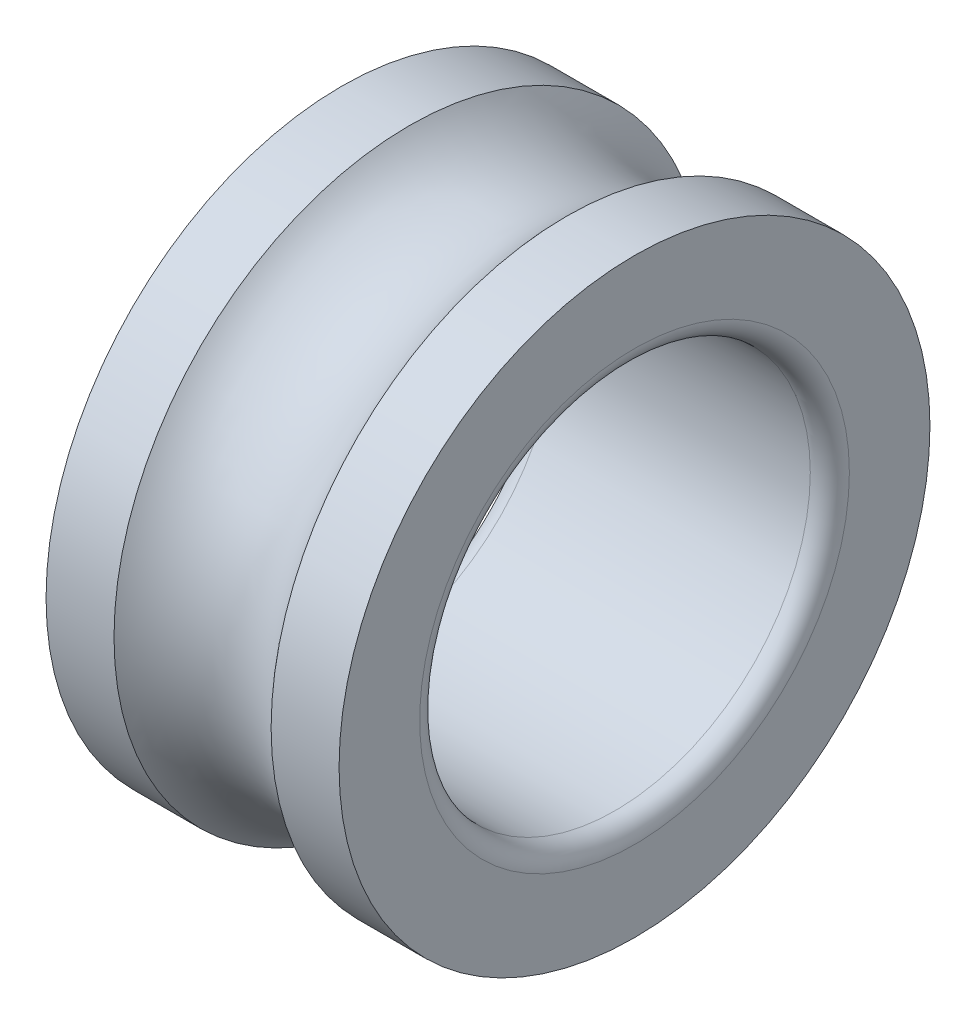
ISO-10303-21;
HEADER;
FILE_DESCRIPTION(('STEP AP214'),'2;1');
FILE_NAME('part.step','',(''),(''),'','','');
FILE_SCHEMA(('AUTOMOTIVE_DESIGN { 1 0 10303 214 1 1 1 1 }'));
ENDSEC;
DATA;
#1=APPLICATION_CONTEXT('core data for automotive mechanical design processes');
#2=APPLICATION_PROTOCOL_DEFINITION('international standard','automotive_design',2000,#1);
#3=PRODUCT_CONTEXT('',#1,'mechanical');
#4=PRODUCT('Part','Part','',(#3));
#5=PRODUCT_RELATED_PRODUCT_CATEGORY('part','',(#4));
#6=PRODUCT_DEFINITION_FORMATION('','',#4);
#7=PRODUCT_DEFINITION_CONTEXT('part definition',#1,'design');
#8=PRODUCT_DEFINITION('design','',#6,#7);
#9=PRODUCT_DEFINITION_SHAPE('','',#8);
#10=(LENGTH_UNIT() NAMED_UNIT(*) SI_UNIT(.MILLI.,.METRE.));
#11=(NAMED_UNIT(*) PLANE_ANGLE_UNIT() SI_UNIT($,.RADIAN.));
#12=(NAMED_UNIT(*) SI_UNIT($,.STERADIAN.) SOLID_ANGLE_UNIT());
#13=UNCERTAINTY_MEASURE_WITH_UNIT(LENGTH_MEASURE(1.E-05),#10,'distance_accuracy_value','');
#14=(GEOMETRIC_REPRESENTATION_CONTEXT(3) GLOBAL_UNCERTAINTY_ASSIGNED_CONTEXT((#13)) GLOBAL_UNIT_ASSIGNED_CONTEXT((#10,
#11,#12)) REPRESENTATION_CONTEXT('',''));
#15=CARTESIAN_POINT('',(0.,0.,0.));
#16=DIRECTION('',(0.,0.,1.));
#17=DIRECTION('',(1.,0.,0.));
#18=AXIS2_PLACEMENT_3D('',#15,#16,#17);
#19=CARTESIAN_POINT('',(7.5,0.,0.));
#20=DIRECTION('',(-1.,0.,0.));
#21=DIRECTION('',(0.,0.,1.));
#22=AXIS2_PLACEMENT_3D('',#19,#20,#21);
#23=CYLINDRICAL_SURFACE('',#22,15.125);
#24=CARTESIAN_POINT('',(-7.5,0.,0.));
#25=DIRECTION('',(1.,0.,0.));
#26=DIRECTION('',(0.,0.,-1.));
#27=AXIS2_PLACEMENT_3D('',#24,#25,#26);
#28=CIRCLE('',#27,15.125);
#29=CARTESIAN_POINT('',(-7.5,0.,-15.125));
#30=VERTEX_POINT('',#29);
#31=EDGE_CURVE('E70',#30,#30,#28,.T.);
#32=ORIENTED_EDGE('',*,*,#31,.T.);
#33=EDGE_LOOP('',(#32));
#34=FACE_BOUND('',#33,.T.);
#35=CARTESIAN_POINT('',(-4.02142698553635,0.,0.));
#36=DIRECTION('',(1.,0.,0.));
#37=DIRECTION('',(0.,0.,-1.));
#38=AXIS2_PLACEMENT_3D('',#35,#36,#37);
#39=CIRCLE('',#38,15.125);
#40=CARTESIAN_POINT('',(-4.02142698553635,0.,-15.125));
#41=VERTEX_POINT('',#40);
#42=EDGE_CURVE('E66',#41,#41,#39,.T.);
#43=ORIENTED_EDGE('',*,*,#42,.F.);
#44=EDGE_LOOP('',(#43));
#45=FACE_BOUND('',#44,.T.);
#46=ADVANCED_FACE('F41',(#34,#45),#23,.T.);
#47=CARTESIAN_POINT('',(7.5,0.,0.));
#48=DIRECTION('',(1.,0.,0.));
#49=DIRECTION('',(0.,0.,-1.));
#50=AXIS2_PLACEMENT_3D('',#47,#48,#49);
#51=CIRCLE('',#50,15.125);
#52=CARTESIAN_POINT('',(7.5,0.,-15.125));
#53=VERTEX_POINT('',#52);
#54=EDGE_CURVE('E65',#53,#53,#51,.T.);
#55=ORIENTED_EDGE('',*,*,#54,.F.);
#56=EDGE_LOOP('',(#55));
#57=FACE_BOUND('',#56,.T.);
#58=CARTESIAN_POINT('',(4.02142698553635,0.,0.));
#59=DIRECTION('',(-1.,0.,0.));
#60=DIRECTION('',(0.,0.,1.));
#61=AXIS2_PLACEMENT_3D('',#58,#59,#60);
#62=CIRCLE('',#61,15.125);
#63=CARTESIAN_POINT('',(4.02142698553635,0.,15.125));
#64=VERTEX_POINT('',#63);
#65=EDGE_CURVE('E71',#64,#64,#62,.T.);
#66=ORIENTED_EDGE('',*,*,#65,.F.);
#67=EDGE_LOOP('',(#66));
#68=FACE_BOUND('',#67,.T.);
#69=ADVANCED_FACE('F84',(#57,#68),#23,.T.);
#70=CARTESIAN_POINT('',(7.5,0.,0.));
#71=DIRECTION('',(1.,0.,0.));
#72=DIRECTION('',(0.,0.,-1.));
#73=AXIS2_PLACEMENT_3D('',#70,#71,#72);
#74=PLANE('',#73);
#75=CARTESIAN_POINT('',(7.5,0.,0.));
#76=DIRECTION('',(1.,0.,0.));
#77=DIRECTION('',(0.,0.,-1.));
#78=AXIS2_PLACEMENT_3D('',#75,#76,#77);
#79=CIRCLE('',#78,11.);
#80=CARTESIAN_POINT('',(7.5,0.,-11.));
#81=VERTEX_POINT('',#80);
#82=EDGE_CURVE('E10',#81,#81,#79,.F.);
#83=ORIENTED_EDGE('',*,*,#82,.T.);
#84=EDGE_LOOP('',(#83));
#85=FACE_BOUND('',#84,.T.);
#86=ORIENTED_EDGE('',*,*,#54,.T.);
#87=EDGE_LOOP('',(#86));
#88=FACE_BOUND('',#87,.T.);
#89=ADVANCED_FACE('F82',(#85,#88),#74,.T.);
#90=CARTESIAN_POINT('',(-7.5,0.,0.));
#91=DIRECTION('',(1.,0.,0.));
#92=DIRECTION('',(0.,0.,-1.));
#93=AXIS2_PLACEMENT_3D('',#90,#91,#92);
#94=PLANE('',#93);
#95=CARTESIAN_POINT('',(-7.5,0.,0.));
#96=DIRECTION('',(1.,0.,0.));
#97=DIRECTION('',(0.,0.,-1.));
#98=AXIS2_PLACEMENT_3D('',#95,#96,#97);
#99=CIRCLE('',#98,11.);
#100=CARTESIAN_POINT('',(-7.5,0.,-11.));
#101=VERTEX_POINT('',#100);
#102=EDGE_CURVE('E59',#101,#101,#99,.T.);
#103=ORIENTED_EDGE('',*,*,#102,.T.);
#104=EDGE_LOOP('',(#103));
#105=FACE_BOUND('',#104,.T.);
#106=ORIENTED_EDGE('',*,*,#31,.F.);
#107=EDGE_LOOP('',(#106));
#108=FACE_BOUND('',#107,.T.);
#109=ADVANCED_FACE('F103',(#105,#108),#94,.F.);
#110=CARTESIAN_POINT('',(7.5,0.,0.));
#111=DIRECTION('',(-1.,0.,0.));
#112=DIRECTION('',(0.,0.,1.));
#113=AXIS2_PLACEMENT_3D('',#110,#111,#112);
#114=CYLINDRICAL_SURFACE('',#113,10.);
#115=CARTESIAN_POINT('',(-6.5,0.,0.));
#116=DIRECTION('',(1.,0.,0.));
#117=DIRECTION('',(0.,0.,-1.));
#118=AXIS2_PLACEMENT_3D('',#115,#116,#117);
#119=CIRCLE('',#118,10.);
#120=CARTESIAN_POINT('',(-6.5,0.,-10.));
#121=VERTEX_POINT('',#120);
#122=EDGE_CURVE('E49',#121,#121,#119,.F.);
#123=ORIENTED_EDGE('',*,*,#122,.T.);
#124=EDGE_LOOP('',(#123));
#125=FACE_BOUND('',#124,.T.);
#126=CARTESIAN_POINT('',(6.5,0.,0.));
#127=DIRECTION('',(1.,0.,0.));
#128=DIRECTION('',(0.,0.,-1.));
#129=AXIS2_PLACEMENT_3D('',#126,#127,#128);
#130=CIRCLE('',#129,10.);
#131=CARTESIAN_POINT('',(6.5,0.,-10.));
#132=VERTEX_POINT('',#131);
#133=EDGE_CURVE('E54',#132,#132,#130,.T.);
#134=ORIENTED_EDGE('',*,*,#133,.T.);
#135=EDGE_LOOP('',(#134));
#136=FACE_BOUND('',#135,.T.);
#137=ADVANCED_FACE('F94',(#125,#136),#114,.F.);
#138=CARTESIAN_POINT('',(0.,0.,0.));
#139=DIRECTION('',(-1.,0.,0.));
#140=DIRECTION('',(0.,0.,1.));
#141=AXIS2_PLACEMENT_3D('',#138,#139,#140);
#142=TOROIDAL_SURFACE('',#141,18.5,5.25);
#143=ORIENTED_EDGE('',*,*,#65,.T.);
#144=EDGE_LOOP('',(#143));
#145=FACE_BOUND('',#144,.T.);
#146=ORIENTED_EDGE('',*,*,#42,.T.);
#147=EDGE_LOOP('',(#146));
#148=FACE_BOUND('',#147,.T.);
#149=ADVANCED_FACE('F90',(#145,#148),#142,.F.);
#150=CARTESIAN_POINT('',(-6.5,0.,0.));
#151=DIRECTION('',(1.,0.,0.));
#152=DIRECTION('',(0.,0.,-1.));
#153=AXIS2_PLACEMENT_3D('',#150,#151,#152);
#154=TOROIDAL_SURFACE('',#153,11.,1.);
#155=ORIENTED_EDGE('',*,*,#122,.F.);
#156=EDGE_LOOP('',(#155));
#157=FACE_BOUND('',#156,.T.);
#158=ORIENTED_EDGE('',*,*,#102,.F.);
#159=EDGE_LOOP('',(#158));
#160=FACE_BOUND('',#159,.T.);
#161=ADVANCED_FACE('F93',(#157,#160),#154,.T.);
#162=CARTESIAN_POINT('',(6.5,0.,0.));
#163=DIRECTION('',(1.,0.,0.));
#164=DIRECTION('',(0.,0.,-1.));
#165=AXIS2_PLACEMENT_3D('',#162,#163,#164);
#166=TOROIDAL_SURFACE('',#165,11.,1.);
#167=ORIENTED_EDGE('',*,*,#82,.F.);
#168=EDGE_LOOP('',(#167));
#169=FACE_BOUND('',#168,.T.);
#170=ORIENTED_EDGE('',*,*,#133,.F.);
#171=EDGE_LOOP('',(#170));
#172=FACE_BOUND('',#171,.T.);
#173=ADVANCED_FACE('F43',(#169,#172),#166,.T.);
#174=CLOSED_SHELL('',(#46,#69,#89,#109,#137,#149,#161,#173));
#175=MANIFOLD_SOLID_BREP('B2',#174);
#176=ADVANCED_BREP_SHAPE_REPRESENTATION('',(#18,#175),#14);
#177=SHAPE_DEFINITION_REPRESENTATION(#9,#176);
ENDSEC;
END-ISO-10303-21;
